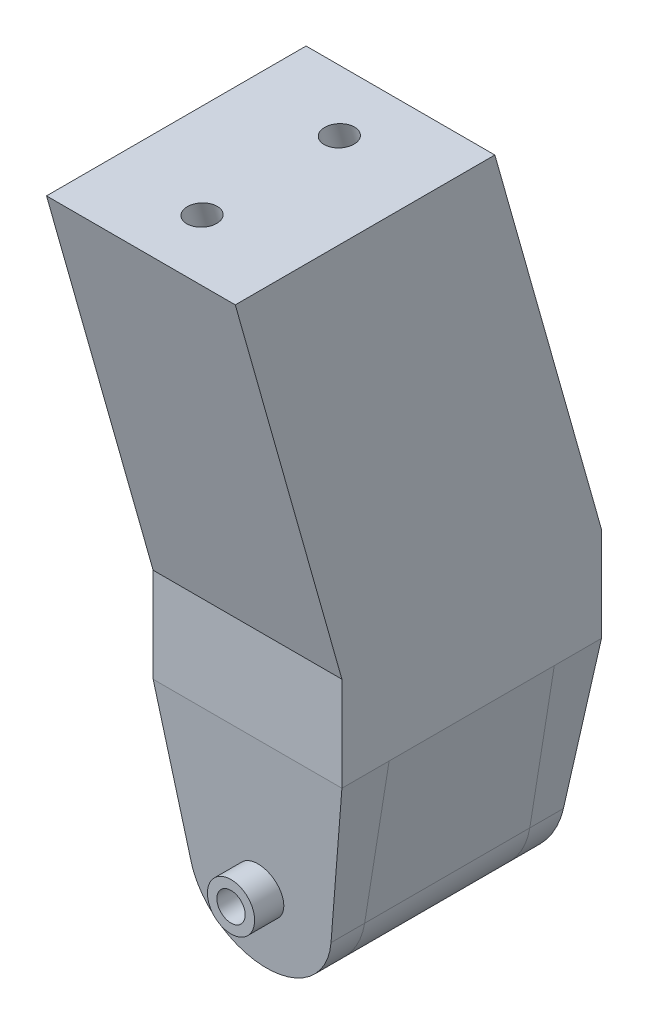
ISO-10303-21;
HEADER;
FILE_DESCRIPTION(('STEP AP214'),'2;1');
FILE_NAME('part.step','',(''),(''),'','','');
FILE_SCHEMA(('AUTOMOTIVE_DESIGN { 1 0 10303 214 1 1 1 1 }'));
ENDSEC;
DATA;
#1=APPLICATION_CONTEXT('core data for automotive mechanical design processes');
#2=APPLICATION_PROTOCOL_DEFINITION('international standard','automotive_design',2000,#1);
#3=PRODUCT_CONTEXT('',#1,'mechanical');
#4=PRODUCT('Part','Part','',(#3));
#5=PRODUCT_RELATED_PRODUCT_CATEGORY('part','',(#4));
#6=PRODUCT_DEFINITION_FORMATION('','',#4);
#7=PRODUCT_DEFINITION_CONTEXT('part definition',#1,'design');
#8=PRODUCT_DEFINITION('design','',#6,#7);
#9=PRODUCT_DEFINITION_SHAPE('','',#8);
#10=(LENGTH_UNIT() NAMED_UNIT(*) SI_UNIT(.MILLI.,.METRE.));
#11=(NAMED_UNIT(*) PLANE_ANGLE_UNIT() SI_UNIT($,.RADIAN.));
#12=(NAMED_UNIT(*) SI_UNIT($,.STERADIAN.) SOLID_ANGLE_UNIT());
#13=UNCERTAINTY_MEASURE_WITH_UNIT(LENGTH_MEASURE(1.E-05),#10,'distance_accuracy_value','');
#14=(GEOMETRIC_REPRESENTATION_CONTEXT(3) GLOBAL_UNCERTAINTY_ASSIGNED_CONTEXT((#13)) GLOBAL_UNIT_ASSIGNED_CONTEXT((#10,
#11,#12)) REPRESENTATION_CONTEXT('',''));
#15=CARTESIAN_POINT('',(0.,0.,0.));
#16=DIRECTION('',(0.,0.,1.));
#17=DIRECTION('',(1.,0.,0.));
#18=AXIS2_PLACEMENT_3D('',#15,#16,#17);
#19=CARTESIAN_POINT('',(0.,-30.,17.5));
#20=DIRECTION('',(0.,0.,1.));
#21=DIRECTION('',(1.,0.,0.));
#22=AXIS2_PLACEMENT_3D('',#19,#20,#21);
#23=PLANE('',#22);
#24=CARTESIAN_POINT('',(0.,-30.,17.5));
#25=DIRECTION('',(0.,0.,1.));
#26=DIRECTION('',(1.,0.,0.));
#27=AXIS2_PLACEMENT_3D('',#24,#25,#26);
#28=CIRCLE('',#27,15.);
#29=CARTESIAN_POINT('',(-14.8109512920612,-32.3739675280408,17.5));
#30=VERTEX_POINT('',#29);
#31=CARTESIAN_POINT('',(14.8109512920612,-32.3739675280408,17.5));
#32=VERTEX_POINT('',#31);
#33=EDGE_CURVE('E100',#30,#32,#28,.T.);
#34=ORIENTED_EDGE('',*,*,#33,.F.);
#35=DIRECTION('',(0.158264501869385,-0.987396752804077,0.));
#36=VECTOR('',#35,1.);
#37=CARTESIAN_POINT('',(-20.,0.,17.5));
#38=LINE('',#37,#36);
#39=CARTESIAN_POINT('',(-20.,0.,17.5));
#40=VERTEX_POINT('',#39);
#41=EDGE_CURVE('E13',#40,#30,#38,.T.);
#42=ORIENTED_EDGE('',*,*,#41,.F.);
#43=DIRECTION('',(-1.,0.,0.));
#44=VECTOR('',#43,1.);
#45=CARTESIAN_POINT('',(20.,0.,17.5));
#46=LINE('',#45,#44);
#47=CARTESIAN_POINT('',(20.,0.,17.5));
#48=VERTEX_POINT('',#47);
#49=EDGE_CURVE('E106',#48,#40,#46,.T.);
#50=ORIENTED_EDGE('',*,*,#49,.F.);
#51=DIRECTION('',(0.158264501869385,0.987396752804077,0.));
#52=VECTOR('',#51,1.);
#53=CARTESIAN_POINT('',(14.8109512920612,-32.3739675280408,17.5));
#54=LINE('',#53,#52);
#55=EDGE_CURVE('E95',#32,#48,#54,.T.);
#56=ORIENTED_EDGE('',*,*,#55,.F.);
#57=EDGE_LOOP('',(#34,#42,#50,#56));
#58=FACE_BOUND('',#57,.T.);
#59=CARTESIAN_POINT('',(0.,-30.,17.5));
#60=DIRECTION('',(0.,0.,1.));
#61=DIRECTION('',(1.,0.,0.));
#62=AXIS2_PLACEMENT_3D('',#59,#60,#61);
#63=CIRCLE('',#62,3.);
#64=CARTESIAN_POINT('',(3.,-30.,17.5));
#65=VERTEX_POINT('',#64);
#66=EDGE_CURVE('E112',#65,#65,#63,.T.);
#67=ORIENTED_EDGE('',*,*,#66,.T.);
#68=EDGE_LOOP('',(#67));
#69=FACE_BOUND('',#68,.T.);
#70=ADVANCED_FACE('F53',(#58,#69),#23,.F.);
#71=CARTESIAN_POINT('',(0.,-30.,87.7079728939615));
#72=DIRECTION('',(0.,0.,-1.));
#73=DIRECTION('',(-1.,0.,0.));
#74=AXIS2_PLACEMENT_3D('',#71,#72,#73);
#75=CYLINDRICAL_SURFACE('',#74,15.);
#76=CARTESIAN_POINT('',(0.,-30.,24.8333333333333));
#77=DIRECTION('',(0.,0.0885397902837944,-0.996072640692687));
#78=DIRECTION('',(0.,-0.996072640692687,-0.0885397902837944));
#79=AXIS2_PLACEMENT_3D('',#76,#77,#78);
#80=ELLIPSE('',#79,15.059142664102,15.);
#81=CARTESIAN_POINT('',(14.8109512920612,-32.3739675280408,24.6223139975075));
#82=VERTEX_POINT('',#81);
#83=CARTESIAN_POINT('',(-14.8109512920612,-32.3739675280408,24.6223139975075));
#84=VERTEX_POINT('',#83);
#85=EDGE_CURVE('E123',#82,#84,#80,.T.);
#86=ORIENTED_EDGE('',*,*,#85,.T.);
#87=DIRECTION('',(0.,0.,-1.));
#88=VECTOR('',#87,1.);
#89=CARTESIAN_POINT('',(-14.8109512920612,-32.3739675280408,87.7079728939615));
#90=LINE('',#89,#88);
#91=EDGE_CURVE('E110',#84,#30,#90,.T.);
#92=ORIENTED_EDGE('',*,*,#91,.T.);
#93=ORIENTED_EDGE('',*,*,#33,.T.);
#94=DIRECTION('',(0.,0.,-1.));
#95=VECTOR('',#94,1.);
#96=CARTESIAN_POINT('',(14.8109512920612,-32.3739675280408,87.7079728939615));
#97=LINE('',#96,#95);
#98=EDGE_CURVE('E92',#82,#32,#97,.T.);
#99=ORIENTED_EDGE('',*,*,#98,.F.);
#100=EDGE_LOOP('',(#86,#92,#93,#99));
#101=FACE_BOUND('',#100,.T.);
#102=ADVANCED_FACE('F108',(#101),#75,.T.);
#103=CARTESIAN_POINT('',(14.8109512920612,-32.3739675280408,87.7079728939615));
#104=DIRECTION('',(-0.987396752804077,0.158264501869385,0.));
#105=DIRECTION('',(-0.158264501869385,-0.987396752804077,0.));
#106=AXIS2_PLACEMENT_3D('',#103,#104,#105);
#107=PLANE('',#106);
#108=DIRECTION('',(0.,0.,-1.));
#109=VECTOR('',#108,1.);
#110=CARTESIAN_POINT('',(20.,0.,87.7079728939615));
#111=LINE('',#110,#109);
#112=CARTESIAN_POINT('',(20.,0.,27.5));
#113=VERTEX_POINT('',#112);
#114=EDGE_CURVE('E87',#113,#48,#111,.T.);
#115=ORIENTED_EDGE('',*,*,#114,.F.);
#116=DIRECTION('',(-0.157658419647184,-0.983615465079638,-0.0874324857848568));
#117=VECTOR('',#116,1.);
#118=CARTESIAN_POINT('',(15.6805535090223,-26.9486043220371,25.1045685047078));
#119=LINE('',#118,#117);
#120=EDGE_CURVE('E72',#113,#82,#119,.T.);
#121=ORIENTED_EDGE('',*,*,#120,.T.);
#122=ORIENTED_EDGE('',*,*,#98,.T.);
#123=ORIENTED_EDGE('',*,*,#55,.T.);
#124=EDGE_LOOP('',(#115,#121,#122,#123));
#125=FACE_BOUND('',#124,.T.);
#126=ADVANCED_FACE('F94',(#125),#107,.F.);
#127=CARTESIAN_POINT('',(20.,0.,87.7079728939615));
#128=DIRECTION('',(0.,-1.,0.));
#129=DIRECTION('',(0.,0.,-1.));
#130=AXIS2_PLACEMENT_3D('',#127,#128,#129);
#131=PLANE('',#130);
#132=DIRECTION('',(0.,0.,-1.));
#133=VECTOR('',#132,1.);
#134=CARTESIAN_POINT('',(-20.,0.,87.7079728939615));
#135=LINE('',#134,#133);
#136=CARTESIAN_POINT('',(-20.,0.,27.5));
#137=VERTEX_POINT('',#136);
#138=EDGE_CURVE('E63',#137,#40,#135,.T.);
#139=ORIENTED_EDGE('',*,*,#138,.F.);
#140=DIRECTION('',(1.,0.,0.));
#141=VECTOR('',#140,1.);
#142=CARTESIAN_POINT('',(20.,0.,27.5));
#143=LINE('',#142,#141);
#144=EDGE_CURVE('E57',#137,#113,#143,.T.);
#145=ORIENTED_EDGE('',*,*,#144,.T.);
#146=ORIENTED_EDGE('',*,*,#114,.T.);
#147=ORIENTED_EDGE('',*,*,#49,.T.);
#148=EDGE_LOOP('',(#139,#145,#146,#147));
#149=FACE_BOUND('',#148,.T.);
#150=ADVANCED_FACE('F159',(#149),#131,.F.);
#151=CARTESIAN_POINT('',(-20.,0.,87.7079728939615));
#152=DIRECTION('',(0.987396752804077,0.158264501869385,0.));
#153=DIRECTION('',(-0.158264501869385,0.987396752804077,0.));
#154=AXIS2_PLACEMENT_3D('',#151,#152,#153);
#155=PLANE('',#154);
#156=ORIENTED_EDGE('',*,*,#91,.F.);
#157=DIRECTION('',(-0.157658419647184,0.983615465079638,0.0874324857848568));
#158=VECTOR('',#157,1.);
#159=CARTESIAN_POINT('',(-20.8299348476848,5.17788236757763,27.9602562104513));
#160=LINE('',#159,#158);
#161=EDGE_CURVE('E125',#84,#137,#160,.T.);
#162=ORIENTED_EDGE('',*,*,#161,.T.);
#163=ORIENTED_EDGE('',*,*,#138,.T.);
#164=ORIENTED_EDGE('',*,*,#41,.T.);
#165=EDGE_LOOP('',(#156,#162,#163,#164));
#166=FACE_BOUND('',#165,.T.);
#167=ADVANCED_FACE('F156',(#166),#155,.F.);
#168=CARTESIAN_POINT('',(0.,-30.,87.7079728939615));
#169=DIRECTION('',(0.,0.,-1.));
#170=DIRECTION('',(-1.,0.,0.));
#171=AXIS2_PLACEMENT_3D('',#168,#169,#170);
#172=CYLINDRICAL_SURFACE('',#171,3.);
#173=ORIENTED_EDGE('',*,*,#66,.F.);
#174=EDGE_LOOP('',(#173));
#175=FACE_BOUND('',#174,.T.);
#176=CARTESIAN_POINT('',(0.,-30.,31.));
#177=DIRECTION('',(0.,0.,1.));
#178=DIRECTION('',(1.,0.,0.));
#179=AXIS2_PLACEMENT_3D('',#176,#177,#178);
#180=CIRCLE('',#179,3.);
#181=CARTESIAN_POINT('',(3.,-30.,31.));
#182=VERTEX_POINT('',#181);
#183=EDGE_CURVE('E133',#182,#182,#180,.T.);
#184=ORIENTED_EDGE('',*,*,#183,.T.);
#185=EDGE_LOOP('',(#184));
#186=FACE_BOUND('',#185,.T.);
#187=ADVANCED_FACE('F55',(#175,#186),#172,.F.);
#188=CARTESIAN_POINT('',(-20.,0.,27.5));
#189=DIRECTION('',(0.,0.0885397902837944,-0.996072640692687));
#190=DIRECTION('',(0.,0.996072640692687,0.0885397902837944));
#191=AXIS2_PLACEMENT_3D('',#188,#189,#190);
#192=PLANE('',#191);
#193=CARTESIAN_POINT('',(0.,-30.,24.8333333333333));
#194=DIRECTION('',(0.,0.0885397902837944,-0.996072640692687));
#195=DIRECTION('',(0.,0.996072640692687,0.0885397902837944));
#196=AXIS2_PLACEMENT_3D('',#193,#194,#195);
#197=ELLIPSE('',#196,5.01971422136734,5.);
#198=CARTESIAN_POINT('',(0.,-25.,25.2777777777778));
#199=VERTEX_POINT('',#198);
#200=EDGE_CURVE('E127',#199,#199,#197,.F.);
#201=ORIENTED_EDGE('',*,*,#200,.F.);
#202=EDGE_LOOP('',(#201));
#203=FACE_BOUND('',#202,.T.);
#204=ORIENTED_EDGE('',*,*,#144,.F.);
#205=ORIENTED_EDGE('',*,*,#161,.F.);
#206=ORIENTED_EDGE('',*,*,#85,.F.);
#207=ORIENTED_EDGE('',*,*,#120,.F.);
#208=EDGE_LOOP('',(#204,#205,#206,#207));
#209=FACE_BOUND('',#208,.T.);
#210=ADVANCED_FACE('F146',(#203,#209),#192,.F.);
#211=CARTESIAN_POINT('',(0.,-30.,10.6633175903731));
#212=DIRECTION('',(0.,0.,1.));
#213=DIRECTION('',(1.,0.,0.));
#214=AXIS2_PLACEMENT_3D('',#211,#212,#213);
#215=CYLINDRICAL_SURFACE('',#214,5.);
#216=ORIENTED_EDGE('',*,*,#200,.T.);
#217=EDGE_LOOP('',(#216));
#218=FACE_BOUND('',#217,.T.);
#219=CARTESIAN_POINT('',(0.,-30.,31.));
#220=DIRECTION('',(0.,0.,1.));
#221=DIRECTION('',(1.,0.,0.));
#222=AXIS2_PLACEMENT_3D('',#219,#220,#221);
#223=CIRCLE('',#222,5.);
#224=CARTESIAN_POINT('',(5.,-30.,31.));
#225=VERTEX_POINT('',#224);
#226=EDGE_CURVE('E130',#225,#225,#223,.T.);
#227=ORIENTED_EDGE('',*,*,#226,.F.);
#228=EDGE_LOOP('',(#227));
#229=FACE_BOUND('',#228,.T.);
#230=ADVANCED_FACE('F140',(#218,#229),#215,.T.);
#231=CARTESIAN_POINT('',(0.,-30.,31.));
#232=DIRECTION('',(0.,0.,1.));
#233=DIRECTION('',(1.,0.,0.));
#234=AXIS2_PLACEMENT_3D('',#231,#232,#233);
#235=PLANE('',#234);
#236=ORIENTED_EDGE('',*,*,#226,.T.);
#237=EDGE_LOOP('',(#236));
#238=FACE_BOUND('',#237,.T.);
#239=ORIENTED_EDGE('',*,*,#183,.F.);
#240=EDGE_LOOP('',(#239));
#241=FACE_BOUND('',#240,.T.);
#242=ADVANCED_FACE('F138',(#238,#241),#235,.T.);
#243=CLOSED_SHELL('',(#70,#102,#126,#150,#167,#187,#210,#230,#242));
#244=MANIFOLD_SOLID_BREP('B2',#243);
#245=CARTESIAN_POINT('',(0.,-30.,-17.5));
#246=DIRECTION('',(0.,0.,-1.));
#247=DIRECTION('',(-1.,0.,0.));
#248=AXIS2_PLACEMENT_3D('',#245,#246,#247);
#249=PLANE('',#248);
#250=DIRECTION('',(-0.158264501869385,0.987396752804077,0.));
#251=VECTOR('',#250,1.);
#252=CARTESIAN_POINT('',(-14.8109512920612,-32.3739675280408,-17.5));
#253=LINE('',#252,#251);
#254=CARTESIAN_POINT('',(-14.8109512920612,-32.3739675280408,-17.5));
#255=VERTEX_POINT('',#254);
#256=CARTESIAN_POINT('',(-20.,0.,-17.5));
#257=VERTEX_POINT('',#256);
#258=EDGE_CURVE('E308',#255,#257,#253,.T.);
#259=ORIENTED_EDGE('',*,*,#258,.F.);
#260=CARTESIAN_POINT('',(0.,-30.,-17.5));
#261=DIRECTION('',(0.,0.,-1.));
#262=DIRECTION('',(-1.,0.,0.));
#263=AXIS2_PLACEMENT_3D('',#260,#261,#262);
#264=CIRCLE('',#263,15.);
#265=CARTESIAN_POINT('',(14.8109512920612,-32.3739675280408,-17.5));
#266=VERTEX_POINT('',#265);
#267=EDGE_CURVE('E291',#266,#255,#264,.T.);
#268=ORIENTED_EDGE('',*,*,#267,.F.);
#269=DIRECTION('',(-0.158264501869385,-0.987396752804077,0.));
#270=VECTOR('',#269,1.);
#271=CARTESIAN_POINT('',(20.,0.,-17.5));
#272=LINE('',#271,#270);
#273=CARTESIAN_POINT('',(20.,0.,-17.5));
#274=VERTEX_POINT('',#273);
#275=EDGE_CURVE('E305',#274,#266,#272,.T.);
#276=ORIENTED_EDGE('',*,*,#275,.F.);
#277=DIRECTION('',(1.,0.,0.));
#278=VECTOR('',#277,1.);
#279=CARTESIAN_POINT('',(-20.,0.,-17.5));
#280=LINE('',#279,#278);
#281=EDGE_CURVE('E300',#257,#274,#280,.T.);
#282=ORIENTED_EDGE('',*,*,#281,.F.);
#283=EDGE_LOOP('',(#259,#268,#276,#282));
#284=FACE_BOUND('',#283,.T.);
#285=CARTESIAN_POINT('',(0.,-30.,-17.5));
#286=DIRECTION('',(0.,0.,-1.));
#287=DIRECTION('',(-1.,0.,0.));
#288=AXIS2_PLACEMENT_3D('',#285,#286,#287);
#289=CIRCLE('',#288,3.);
#290=CARTESIAN_POINT('',(-3.,-30.,-17.5));
#291=VERTEX_POINT('',#290);
#292=EDGE_CURVE('E309',#291,#291,#289,.T.);
#293=ORIENTED_EDGE('',*,*,#292,.T.);
#294=EDGE_LOOP('',(#293));
#295=FACE_BOUND('',#294,.T.);
#296=ADVANCED_FACE('F240',(#284,#295),#249,.F.);
#297=CARTESIAN_POINT('',(-14.8109512920612,-32.3739675280408,-27.5));
#298=DIRECTION('',(0.987396752804077,0.158264501869385,0.));
#299=DIRECTION('',(-0.158264501869385,0.987396752804077,0.));
#300=AXIS2_PLACEMENT_3D('',#297,#298,#299);
#301=PLANE('',#300);
#302=DIRECTION('',(0.,0.,1.));
#303=VECTOR('',#302,1.);
#304=CARTESIAN_POINT('',(-20.,0.,-27.5));
#305=LINE('',#304,#303);
#306=CARTESIAN_POINT('',(-20.,0.,-27.5));
#307=VERTEX_POINT('',#306);
#308=EDGE_CURVE('E51',#307,#257,#305,.T.);
#309=ORIENTED_EDGE('',*,*,#308,.F.);
#310=DIRECTION('',(0.157658419647184,-0.983615465079638,0.0874324857848567));
#311=VECTOR('',#310,1.);
#312=CARTESIAN_POINT('',(-14.8506186613375,-32.1264866896147,-24.6443122942565));
#313=LINE('',#312,#311);
#314=CARTESIAN_POINT('',(-14.8109512920612,-32.3739675280408,-24.6223139975075));
#315=VERTEX_POINT('',#314);
#316=EDGE_CURVE('E287',#307,#315,#313,.T.);
#317=ORIENTED_EDGE('',*,*,#316,.T.);
#318=DIRECTION('',(0.,0.,1.));
#319=VECTOR('',#318,1.);
#320=CARTESIAN_POINT('',(-14.8109512920612,-32.3739675280408,-27.5));
#321=LINE('',#320,#319);
#322=EDGE_CURVE('E255',#315,#255,#321,.T.);
#323=ORIENTED_EDGE('',*,*,#322,.T.);
#324=ORIENTED_EDGE('',*,*,#258,.T.);
#325=EDGE_LOOP('',(#309,#317,#323,#324));
#326=FACE_BOUND('',#325,.T.);
#327=ADVANCED_FACE('F242',(#326),#301,.F.);
#328=CARTESIAN_POINT('',(-20.,0.,-27.5));
#329=DIRECTION('',(0.,-1.,0.));
#330=DIRECTION('',(0.,0.,-1.));
#331=AXIS2_PLACEMENT_3D('',#328,#329,#330);
#332=PLANE('',#331);
#333=ORIENTED_EDGE('',*,*,#281,.T.);
#334=DIRECTION('',(0.,0.,1.));
#335=VECTOR('',#334,1.);
#336=CARTESIAN_POINT('',(20.,0.,-27.5));
#337=LINE('',#336,#335);
#338=CARTESIAN_POINT('',(20.,0.,-27.5));
#339=VERTEX_POINT('',#338);
#340=EDGE_CURVE('E248',#339,#274,#337,.T.);
#341=ORIENTED_EDGE('',*,*,#340,.F.);
#342=DIRECTION('',(1.,0.,0.));
#343=VECTOR('',#342,1.);
#344=CARTESIAN_POINT('',(-20.,0.,-27.5));
#345=LINE('',#344,#343);
#346=EDGE_CURVE('E283',#307,#339,#345,.T.);
#347=ORIENTED_EDGE('',*,*,#346,.F.);
#348=ORIENTED_EDGE('',*,*,#308,.T.);
#349=EDGE_LOOP('',(#333,#341,#347,#348));
#350=FACE_BOUND('',#349,.T.);
#351=ADVANCED_FACE('F299',(#350),#332,.F.);
#352=CARTESIAN_POINT('',(20.,0.,-27.5));
#353=DIRECTION('',(-0.987396752804077,0.158264501869385,0.));
#354=DIRECTION('',(-0.158264501869385,-0.987396752804077,0.));
#355=AXIS2_PLACEMENT_3D('',#352,#353,#354);
#356=PLANE('',#355);
#357=DIRECTION('',(0.,0.,1.));
#358=VECTOR('',#357,1.);
#359=CARTESIAN_POINT('',(14.8109512920612,-32.3739675280408,-27.5));
#360=LINE('',#359,#358);
#361=CARTESIAN_POINT('',(14.8109512920612,-32.3739675280408,-24.6223139975075));
#362=VERTEX_POINT('',#361);
#363=EDGE_CURVE('E262',#362,#266,#360,.T.);
#364=ORIENTED_EDGE('',*,*,#363,.F.);
#365=DIRECTION('',(0.157658419647184,0.983615465079638,-0.0874324857848567));
#366=VECTOR('',#365,1.);
#367=CARTESIAN_POINT('',(20.,0.,-27.5));
#368=LINE('',#367,#366);
#369=EDGE_CURVE('E286',#362,#339,#368,.T.);
#370=ORIENTED_EDGE('',*,*,#369,.T.);
#371=ORIENTED_EDGE('',*,*,#340,.T.);
#372=ORIENTED_EDGE('',*,*,#275,.T.);
#373=EDGE_LOOP('',(#364,#370,#371,#372));
#374=FACE_BOUND('',#373,.T.);
#375=ADVANCED_FACE('F295',(#374),#356,.F.);
#376=CARTESIAN_POINT('',(0.,-30.,-27.5));
#377=DIRECTION('',(0.,0.,1.));
#378=DIRECTION('',(1.,0.,0.));
#379=AXIS2_PLACEMENT_3D('',#376,#377,#378);
#380=CYLINDRICAL_SURFACE('',#379,15.);
#381=CARTESIAN_POINT('',(0.,-30.,-24.8333333333333));
#382=DIRECTION('',(0.,0.0885397902837943,0.996072640692686));
#383=DIRECTION('',(0.,-0.996072640692687,0.0885397902837944));
#384=AXIS2_PLACEMENT_3D('',#381,#382,#383);
#385=ELLIPSE('',#384,15.059142664102,15.);
#386=EDGE_CURVE('E297',#315,#362,#385,.T.);
#387=ORIENTED_EDGE('',*,*,#386,.T.);
#388=ORIENTED_EDGE('',*,*,#363,.T.);
#389=ORIENTED_EDGE('',*,*,#267,.T.);
#390=ORIENTED_EDGE('',*,*,#322,.F.);
#391=EDGE_LOOP('',(#387,#388,#389,#390));
#392=FACE_BOUND('',#391,.T.);
#393=ADVANCED_FACE('F348',(#392),#380,.T.);
#394=CARTESIAN_POINT('',(0.,-30.,-27.5));
#395=DIRECTION('',(0.,0.,1.));
#396=DIRECTION('',(1.,0.,0.));
#397=AXIS2_PLACEMENT_3D('',#394,#395,#396);
#398=CYLINDRICAL_SURFACE('',#397,3.);
#399=ORIENTED_EDGE('',*,*,#292,.F.);
#400=EDGE_LOOP('',(#399));
#401=FACE_BOUND('',#400,.T.);
#402=CARTESIAN_POINT('',(0.,-30.,-31.));
#403=DIRECTION('',(0.,0.,-1.));
#404=DIRECTION('',(-1.,0.,0.));
#405=AXIS2_PLACEMENT_3D('',#402,#403,#404);
#406=CIRCLE('',#405,3.);
#407=CARTESIAN_POINT('',(-3.,-30.,-31.));
#408=VERTEX_POINT('',#407);
#409=EDGE_CURVE('E321',#408,#408,#406,.T.);
#410=ORIENTED_EDGE('',*,*,#409,.T.);
#411=EDGE_LOOP('',(#410));
#412=FACE_BOUND('',#411,.T.);
#413=ADVANCED_FACE('F325',(#401,#412),#398,.F.);
#414=CARTESIAN_POINT('',(-20.,0.,-27.5));
#415=DIRECTION('',(0.,0.0885397902837943,0.996072640692686));
#416=DIRECTION('',(0.,-0.996072640692687,0.0885397902837944));
#417=AXIS2_PLACEMENT_3D('',#414,#415,#416);
#418=PLANE('',#417);
#419=CARTESIAN_POINT('',(0.,-30.,-24.8333333333333));
#420=DIRECTION('',(0.,0.0885397902837943,0.996072640692686));
#421=DIRECTION('',(0.,0.996072640692687,-0.0885397902837944));
#422=AXIS2_PLACEMENT_3D('',#419,#420,#421);
#423=ELLIPSE('',#422,5.01971422136734,5.);
#424=CARTESIAN_POINT('',(0.,-25.,-25.2777777777778));
#425=VERTEX_POINT('',#424);
#426=EDGE_CURVE('E315',#425,#425,#423,.F.);
#427=ORIENTED_EDGE('',*,*,#426,.F.);
#428=EDGE_LOOP('',(#427));
#429=FACE_BOUND('',#428,.T.);
#430=ORIENTED_EDGE('',*,*,#346,.T.);
#431=ORIENTED_EDGE('',*,*,#369,.F.);
#432=ORIENTED_EDGE('',*,*,#386,.F.);
#433=ORIENTED_EDGE('',*,*,#316,.F.);
#434=EDGE_LOOP('',(#430,#431,#432,#433));
#435=FACE_BOUND('',#434,.T.);
#436=ADVANCED_FACE('F285',(#429,#435),#418,.F.);
#437=CARTESIAN_POINT('',(0.,-30.,-10.6633175903731));
#438=DIRECTION('',(0.,0.,-1.));
#439=DIRECTION('',(-1.,0.,0.));
#440=AXIS2_PLACEMENT_3D('',#437,#438,#439);
#441=CYLINDRICAL_SURFACE('',#440,5.);
#442=ORIENTED_EDGE('',*,*,#426,.T.);
#443=EDGE_LOOP('',(#442));
#444=FACE_BOUND('',#443,.T.);
#445=CARTESIAN_POINT('',(0.,-30.,-31.));
#446=DIRECTION('',(0.,0.,-1.));
#447=DIRECTION('',(-1.,0.,0.));
#448=AXIS2_PLACEMENT_3D('',#445,#446,#447);
#449=CIRCLE('',#448,5.);
#450=CARTESIAN_POINT('',(-5.,-30.,-31.));
#451=VERTEX_POINT('',#450);
#452=EDGE_CURVE('E318',#451,#451,#449,.T.);
#453=ORIENTED_EDGE('',*,*,#452,.F.);
#454=EDGE_LOOP('',(#453));
#455=FACE_BOUND('',#454,.T.);
#456=ADVANCED_FACE('F329',(#444,#455),#441,.T.);
#457=CARTESIAN_POINT('',(0.,-30.,-31.));
#458=DIRECTION('',(0.,0.,-1.));
#459=DIRECTION('',(-1.,0.,0.));
#460=AXIS2_PLACEMENT_3D('',#457,#458,#459);
#461=PLANE('',#460);
#462=ORIENTED_EDGE('',*,*,#452,.T.);
#463=EDGE_LOOP('',(#462));
#464=FACE_BOUND('',#463,.T.);
#465=ORIENTED_EDGE('',*,*,#409,.F.);
#466=EDGE_LOOP('',(#465));
#467=FACE_BOUND('',#466,.T.);
#468=ADVANCED_FACE('F327',(#464,#467),#461,.T.);
#469=CLOSED_SHELL('',(#296,#327,#351,#375,#393,#413,#436,#456,#468));
#470=MANIFOLD_SOLID_BREP('B7',#469);
#471=CARTESIAN_POINT('',(20.,0.,87.7079728939615));
#472=DIRECTION('',(-0.987396752804077,0.158264501869385,0.));
#473=DIRECTION('',(-0.158264501869385,-0.987396752804077,0.));
#474=AXIS2_PLACEMENT_3D('',#471,#472,#473);
#475=PLANE('',#474);
#476=DIRECTION('',(0.158264501869385,0.987396752804077,0.));
#477=VECTOR('',#476,1.);
#478=CARTESIAN_POINT('',(20.,0.,17.5));
#479=LINE('',#478,#477);
#480=CARTESIAN_POINT('',(14.8109512920612,-32.3739675280408,17.5));
#481=VERTEX_POINT('',#480);
#482=CARTESIAN_POINT('',(20.,0.,17.5));
#483=VERTEX_POINT('',#482);
#484=EDGE_CURVE('E552',#481,#483,#479,.T.);
#485=ORIENTED_EDGE('',*,*,#484,.F.);
#486=DIRECTION('',(0.,0.,-1.));
#487=VECTOR('',#486,1.);
#488=CARTESIAN_POINT('',(14.8109512920612,-32.3739675280408,87.7079728939615));
#489=LINE('',#488,#487);
#490=CARTESIAN_POINT('',(14.8109512920612,-32.3739675280408,-17.5));
#491=VERTEX_POINT('',#490);
#492=EDGE_CURVE('E588',#481,#491,#489,.T.);
#493=ORIENTED_EDGE('',*,*,#492,.T.);
#494=DIRECTION('',(-0.158264501869385,-0.987396752804077,0.));
#495=VECTOR('',#494,1.);
#496=CARTESIAN_POINT('',(20.,0.,-17.5));
#497=LINE('',#496,#495);
#498=CARTESIAN_POINT('',(20.,0.,-17.5));
#499=VERTEX_POINT('',#498);
#500=EDGE_CURVE('E577',#499,#491,#497,.T.);
#501=ORIENTED_EDGE('',*,*,#500,.F.);
#502=DIRECTION('',(0.,0.,-1.));
#503=VECTOR('',#502,1.);
#504=CARTESIAN_POINT('',(20.,0.,27.5));
#505=LINE('',#504,#503);
#506=EDGE_CURVE('E593',#483,#499,#505,.T.);
#507=ORIENTED_EDGE('',*,*,#506,.F.);
#508=EDGE_LOOP('',(#485,#493,#501,#507));
#509=FACE_BOUND('',#508,.T.);
#510=ADVANCED_FACE('F418',(#509),#475,.F.);
#511=CARTESIAN_POINT('',(0.,-30.,87.7079728939615));
#512=DIRECTION('',(0.,0.,-1.));
#513=DIRECTION('',(-1.,0.,0.));
#514=AXIS2_PLACEMENT_3D('',#511,#512,#513);
#515=CYLINDRICAL_SURFACE('',#514,15.);
#516=CARTESIAN_POINT('',(0.,-30.,17.5));
#517=DIRECTION('',(0.,0.,1.));
#518=DIRECTION('',(1.,0.,0.));
#519=AXIS2_PLACEMENT_3D('',#516,#517,#518);
#520=CIRCLE('',#519,15.);
#521=CARTESIAN_POINT('',(-14.8109512920612,-32.3739675280408,17.5));
#522=VERTEX_POINT('',#521);
#523=EDGE_CURVE('E549',#522,#481,#520,.T.);
#524=ORIENTED_EDGE('',*,*,#523,.F.);
#525=DIRECTION('',(0.,0.,-1.));
#526=VECTOR('',#525,1.);
#527=CARTESIAN_POINT('',(-14.8109512920612,-32.3739675280408,87.7079728939615));
#528=LINE('',#527,#526);
#529=CARTESIAN_POINT('',(-14.8109512920612,-32.3739675280408,-17.5));
#530=VERTEX_POINT('',#529);
#531=EDGE_CURVE('E436',#522,#530,#528,.T.);
#532=ORIENTED_EDGE('',*,*,#531,.T.);
#533=CARTESIAN_POINT('',(0.,-30.,-17.5));
#534=DIRECTION('',(0.,0.,-1.));
#535=DIRECTION('',(-1.,0.,0.));
#536=AXIS2_PLACEMENT_3D('',#533,#534,#535);
#537=CIRCLE('',#536,15.);
#538=EDGE_CURVE('E565',#491,#530,#537,.T.);
#539=ORIENTED_EDGE('',*,*,#538,.F.);
#540=ORIENTED_EDGE('',*,*,#492,.F.);
#541=EDGE_LOOP('',(#524,#532,#539,#540));
#542=FACE_BOUND('',#541,.T.);
#543=ADVANCED_FACE('F649',(#542),#515,.T.);
#544=CARTESIAN_POINT('',(-20.,0.,87.7079728939615));
#545=DIRECTION('',(0.987396752804077,0.158264501869385,0.));
#546=DIRECTION('',(-0.158264501869385,0.987396752804077,0.));
#547=AXIS2_PLACEMENT_3D('',#544,#545,#546);
#548=PLANE('',#547);
#549=DIRECTION('',(0.158264501869385,-0.987396752804077,0.));
#550=VECTOR('',#549,1.);
#551=CARTESIAN_POINT('',(-14.8109512920612,-32.3739675280408,17.5));
#552=LINE('',#551,#550);
#553=CARTESIAN_POINT('',(-20.,0.,17.5));
#554=VERTEX_POINT('',#553);
#555=EDGE_CURVE('E546',#554,#522,#552,.T.);
#556=ORIENTED_EDGE('',*,*,#555,.F.);
#557=DIRECTION('',(0.,0.,1.));
#558=VECTOR('',#557,1.);
#559=CARTESIAN_POINT('',(-20.,0.,27.5));
#560=LINE('',#559,#558);
#561=CARTESIAN_POINT('',(-20.,0.,-17.5));
#562=VERTEX_POINT('',#561);
#563=EDGE_CURVE('E606',#562,#554,#560,.T.);
#564=ORIENTED_EDGE('',*,*,#563,.F.);
#565=DIRECTION('',(-0.158264501869385,0.987396752804077,0.));
#566=VECTOR('',#565,1.);
#567=CARTESIAN_POINT('',(-14.8109512920612,-32.3739675280408,-17.5));
#568=LINE('',#567,#566);
#569=EDGE_CURVE('E568',#530,#562,#568,.T.);
#570=ORIENTED_EDGE('',*,*,#569,.F.);
#571=ORIENTED_EDGE('',*,*,#531,.F.);
#572=EDGE_LOOP('',(#556,#564,#570,#571));
#573=FACE_BOUND('',#572,.T.);
#574=ADVANCED_FACE('F655',(#573),#548,.F.);
#575=CARTESIAN_POINT('',(0.,-30.,-27.5));
#576=DIRECTION('',(0.,0.,1.));
#577=DIRECTION('',(1.,0.,0.));
#578=AXIS2_PLACEMENT_3D('',#575,#576,#577);
#579=CYLINDRICAL_SURFACE('',#578,3.);
#580=CARTESIAN_POINT('',(0.,-30.,-17.5));
#581=DIRECTION('',(0.,0.,-1.));
#582=DIRECTION('',(-1.,0.,0.));
#583=AXIS2_PLACEMENT_3D('',#580,#581,#582);
#584=CIRCLE('',#583,3.);
#585=CARTESIAN_POINT('',(-3.,-30.,-17.5));
#586=VERTEX_POINT('',#585);
#587=EDGE_CURVE('E587',#586,#586,#584,.F.);
#588=ORIENTED_EDGE('',*,*,#587,.F.);
#589=EDGE_LOOP('',(#588));
#590=FACE_BOUND('',#589,.T.);
#591=CARTESIAN_POINT('',(0.,-30.,17.5));
#592=DIRECTION('',(0.,0.,1.));
#593=DIRECTION('',(1.,0.,0.));
#594=AXIS2_PLACEMENT_3D('',#591,#592,#593);
#595=CIRCLE('',#594,3.);
#596=CARTESIAN_POINT('',(3.,-30.,17.5));
#597=VERTEX_POINT('',#596);
#598=EDGE_CURVE('E564',#597,#597,#595,.F.);
#599=ORIENTED_EDGE('',*,*,#598,.F.);
#600=EDGE_LOOP('',(#599));
#601=FACE_BOUND('',#600,.T.);
#602=ADVANCED_FACE('F659',(#590,#601),#579,.F.);
#603=CARTESIAN_POINT('',(20.,20.,27.5));
#604=DIRECTION('',(-1.,0.,0.));
#605=DIRECTION('',(0.,0.,1.));
#606=AXIS2_PLACEMENT_3D('',#603,#604,#605);
#607=PLANE('',#606);
#608=CARTESIAN_POINT('',(20.,0.,27.5));
#609=VERTEX_POINT('',#608);
#610=EDGE_CURVE('E602',#609,#483,#505,.T.);
#611=ORIENTED_EDGE('',*,*,#610,.T.);
#612=ORIENTED_EDGE('',*,*,#506,.T.);
#613=DIRECTION('',(0.,0.,-1.));
#614=VECTOR('',#613,1.);
#615=CARTESIAN_POINT('',(20.,0.,-17.5));
#616=LINE('',#615,#614);
#617=CARTESIAN_POINT('',(20.,0.,-27.5));
#618=VERTEX_POINT('',#617);
#619=EDGE_CURVE('E581',#499,#618,#616,.T.);
#620=ORIENTED_EDGE('',*,*,#619,.T.);
#621=DIRECTION('',(0.,-1.,0.));
#622=VECTOR('',#621,1.);
#623=CARTESIAN_POINT('',(20.,20.,-27.5));
#624=LINE('',#623,#622);
#625=CARTESIAN_POINT('',(20.,20.,-27.5));
#626=VERTEX_POINT('',#625);
#627=EDGE_CURVE('E238',#626,#618,#624,.T.);
#628=ORIENTED_EDGE('',*,*,#627,.F.);
#629=DIRECTION('',(0.,0.962350499253202,0.27181154608867));
#630=VECTOR('',#629,1.);
#631=CARTESIAN_POINT('',(20.,20.,-27.5));
#632=LINE('',#631,#630);
#633=CARTESIAN_POINT('',(20.,100.,-4.90436181623221));
#634=VERTEX_POINT('',#633);
#635=EDGE_CURVE('E514',#626,#634,#632,.T.);
#636=ORIENTED_EDGE('',*,*,#635,.T.);
#637=DIRECTION('',(0.,0.,-1.));
#638=VECTOR('',#637,1.);
#639=CARTESIAN_POINT('',(20.,100.,50.0956381837678));
#640=LINE('',#639,#638);
#641=CARTESIAN_POINT('',(20.,100.,50.0956381837678));
#642=VERTEX_POINT('',#641);
#643=EDGE_CURVE('E507',#642,#634,#640,.T.);
#644=ORIENTED_EDGE('',*,*,#643,.F.);
#645=DIRECTION('',(0.,0.962350499253202,0.27181154608867));
#646=VECTOR('',#645,1.);
#647=CARTESIAN_POINT('',(20.,20.,27.5));
#648=LINE('',#647,#646);
#649=CARTESIAN_POINT('',(20.,20.,27.5));
#650=VERTEX_POINT('',#649);
#651=EDGE_CURVE('E538',#650,#642,#648,.T.);
#652=ORIENTED_EDGE('',*,*,#651,.F.);
#653=DIRECTION('',(0.,-1.,0.));
#654=VECTOR('',#653,1.);
#655=CARTESIAN_POINT('',(20.,20.,27.5));
#656=LINE('',#655,#654);
#657=EDGE_CURVE('E601',#650,#609,#656,.T.);
#658=ORIENTED_EDGE('',*,*,#657,.T.);
#659=EDGE_LOOP('',(#611,#612,#620,#628,#636,#644,#652,#658));
#660=FACE_BOUND('',#659,.T.);
#661=ADVANCED_FACE('F420',(#660),#607,.F.);
#662=CARTESIAN_POINT('',(-20.,20.,-27.5));
#663=DIRECTION('',(0.,0.,1.));
#664=DIRECTION('',(1.,0.,0.));
#665=AXIS2_PLACEMENT_3D('',#662,#663,#664);
#666=PLANE('',#665);
#667=ORIENTED_EDGE('',*,*,#627,.T.);
#668=DIRECTION('',(1.,0.,0.));
#669=VECTOR('',#668,1.);
#670=CARTESIAN_POINT('',(20.,0.,-27.5));
#671=LINE('',#670,#669);
#672=CARTESIAN_POINT('',(-20.,0.,-27.5));
#673=VERTEX_POINT('',#672);
#674=EDGE_CURVE('E569',#673,#618,#671,.T.);
#675=ORIENTED_EDGE('',*,*,#674,.F.);
#676=DIRECTION('',(0.,-1.,0.));
#677=VECTOR('',#676,1.);
#678=CARTESIAN_POINT('',(-20.,20.,-27.5));
#679=LINE('',#678,#677);
#680=CARTESIAN_POINT('',(-20.,20.,-27.5));
#681=VERTEX_POINT('',#680);
#682=EDGE_CURVE('E428',#681,#673,#679,.T.);
#683=ORIENTED_EDGE('',*,*,#682,.F.);
#684=DIRECTION('',(-1.,0.,0.));
#685=VECTOR('',#684,1.);
#686=CARTESIAN_POINT('',(-20.,20.,-27.5));
#687=LINE('',#686,#685);
#688=EDGE_CURVE('E527',#626,#681,#687,.T.);
#689=ORIENTED_EDGE('',*,*,#688,.F.);
#690=EDGE_LOOP('',(#667,#675,#683,#689));
#691=FACE_BOUND('',#690,.T.);
#692=ADVANCED_FACE('F671',(#691),#666,.F.);
#693=CARTESIAN_POINT('',(-20.,20.,27.5));
#694=DIRECTION('',(1.,0.,0.));
#695=DIRECTION('',(0.,0.,-1.));
#696=AXIS2_PLACEMENT_3D('',#693,#694,#695);
#697=PLANE('',#696);
#698=EDGE_CURVE('E597',#673,#562,#560,.T.);
#699=ORIENTED_EDGE('',*,*,#698,.T.);
#700=ORIENTED_EDGE('',*,*,#563,.T.);
#701=DIRECTION('',(0.,0.,1.));
#702=VECTOR('',#701,1.);
#703=CARTESIAN_POINT('',(-20.,0.,17.5));
#704=LINE('',#703,#702);
#705=CARTESIAN_POINT('',(-20.,0.,27.5));
#706=VERTEX_POINT('',#705);
#707=EDGE_CURVE('E559',#554,#706,#704,.T.);
#708=ORIENTED_EDGE('',*,*,#707,.T.);
#709=DIRECTION('',(0.,-1.,0.));
#710=VECTOR('',#709,1.);
#711=CARTESIAN_POINT('',(-20.,20.,27.5));
#712=LINE('',#711,#710);
#713=CARTESIAN_POINT('',(-20.,20.,27.5));
#714=VERTEX_POINT('',#713);
#715=EDGE_CURVE('E444',#714,#706,#712,.T.);
#716=ORIENTED_EDGE('',*,*,#715,.F.);
#717=DIRECTION('',(0.,0.962350499253202,0.27181154608867));
#718=VECTOR('',#717,1.);
#719=CARTESIAN_POINT('',(-20.,20.,27.5));
#720=LINE('',#719,#718);
#721=CARTESIAN_POINT('',(-20.,100.,50.0956381837678));
#722=VERTEX_POINT('',#721);
#723=EDGE_CURVE('E522',#714,#722,#720,.T.);
#724=ORIENTED_EDGE('',*,*,#723,.T.);
#725=DIRECTION('',(0.,0.,1.));
#726=VECTOR('',#725,1.);
#727=CARTESIAN_POINT('',(-20.,100.,-4.90436181623221));
#728=LINE('',#727,#726);
#729=CARTESIAN_POINT('',(-20.,100.,-4.90436181623221));
#730=VERTEX_POINT('',#729);
#731=EDGE_CURVE('E504',#730,#722,#728,.T.);
#732=ORIENTED_EDGE('',*,*,#731,.F.);
#733=DIRECTION('',(0.,0.962350499253202,0.27181154608867));
#734=VECTOR('',#733,1.);
#735=CARTESIAN_POINT('',(-20.,20.,-27.5));
#736=LINE('',#735,#734);
#737=EDGE_CURVE('E520',#681,#730,#736,.T.);
#738=ORIENTED_EDGE('',*,*,#737,.F.);
#739=ORIENTED_EDGE('',*,*,#682,.T.);
#740=EDGE_LOOP('',(#699,#700,#708,#716,#724,#732,#738,#739));
#741=FACE_BOUND('',#740,.T.);
#742=ADVANCED_FACE('F518',(#741),#697,.F.);
#743=CARTESIAN_POINT('',(-20.,20.,27.5));
#744=DIRECTION('',(0.,0.,-1.));
#745=DIRECTION('',(-1.,0.,0.));
#746=AXIS2_PLACEMENT_3D('',#743,#744,#745);
#747=PLANE('',#746);
#748=ORIENTED_EDGE('',*,*,#715,.T.);
#749=DIRECTION('',(-1.,0.,0.));
#750=VECTOR('',#749,1.);
#751=CARTESIAN_POINT('',(-20.,0.,27.5));
#752=LINE('',#751,#750);
#753=EDGE_CURVE('E513',#609,#706,#752,.T.);
#754=ORIENTED_EDGE('',*,*,#753,.F.);
#755=ORIENTED_EDGE('',*,*,#657,.F.);
#756=DIRECTION('',(1.,0.,0.));
#757=VECTOR('',#756,1.);
#758=CARTESIAN_POINT('',(-20.,20.,27.5));
#759=LINE('',#758,#757);
#760=EDGE_CURVE('E596',#714,#650,#759,.T.);
#761=ORIENTED_EDGE('',*,*,#760,.F.);
#762=EDGE_LOOP('',(#748,#754,#755,#761));
#763=FACE_BOUND('',#762,.T.);
#764=ADVANCED_FACE('F665',(#763),#747,.F.);
#765=CARTESIAN_POINT('',(0.,-30.,-17.5));
#766=DIRECTION('',(0.,0.,-1.));
#767=DIRECTION('',(-1.,0.,0.));
#768=AXIS2_PLACEMENT_3D('',#765,#766,#767);
#769=PLANE('',#768);
#770=ORIENTED_EDGE('',*,*,#538,.T.);
#771=ORIENTED_EDGE('',*,*,#569,.T.);
#772=DIRECTION('',(1.,0.,0.));
#773=VECTOR('',#772,1.);
#774=CARTESIAN_POINT('',(20.,0.,-17.5));
#775=LINE('',#774,#773);
#776=EDGE_CURVE('E573',#562,#499,#775,.T.);
#777=ORIENTED_EDGE('',*,*,#776,.T.);
#778=ORIENTED_EDGE('',*,*,#500,.T.);
#779=EDGE_LOOP('',(#770,#771,#777,#778));
#780=FACE_BOUND('',#779,.T.);
#781=ORIENTED_EDGE('',*,*,#587,.T.);
#782=EDGE_LOOP('',(#781));
#783=FACE_BOUND('',#782,.T.);
#784=ADVANCED_FACE('F668',(#780,#783),#769,.T.);
#785=CARTESIAN_POINT('',(20.,0.,-17.5));
#786=DIRECTION('',(0.,1.,0.));
#787=DIRECTION('',(0.,0.,1.));
#788=AXIS2_PLACEMENT_3D('',#785,#786,#787);
#789=PLANE('',#788);
#790=ORIENTED_EDGE('',*,*,#674,.T.);
#791=ORIENTED_EDGE('',*,*,#619,.F.);
#792=ORIENTED_EDGE('',*,*,#776,.F.);
#793=ORIENTED_EDGE('',*,*,#698,.F.);
#794=EDGE_LOOP('',(#790,#791,#792,#793));
#795=FACE_BOUND('',#794,.T.);
#796=ADVANCED_FACE('F683',(#795),#789,.F.);
#797=CARTESIAN_POINT('',(0.,-30.,17.5));
#798=DIRECTION('',(0.,0.,1.));
#799=DIRECTION('',(1.,0.,0.));
#800=AXIS2_PLACEMENT_3D('',#797,#798,#799);
#801=PLANE('',#800);
#802=ORIENTED_EDGE('',*,*,#555,.T.);
#803=ORIENTED_EDGE('',*,*,#523,.T.);
#804=ORIENTED_EDGE('',*,*,#484,.T.);
#805=DIRECTION('',(-1.,0.,0.));
#806=VECTOR('',#805,1.);
#807=CARTESIAN_POINT('',(-20.,0.,17.5));
#808=LINE('',#807,#806);
#809=EDGE_CURVE('E555',#483,#554,#808,.T.);
#810=ORIENTED_EDGE('',*,*,#809,.T.);
#811=EDGE_LOOP('',(#802,#803,#804,#810));
#812=FACE_BOUND('',#811,.T.);
#813=ORIENTED_EDGE('',*,*,#598,.T.);
#814=EDGE_LOOP('',(#813));
#815=FACE_BOUND('',#814,.T.);
#816=ADVANCED_FACE('F703',(#812,#815),#801,.T.);
#817=CARTESIAN_POINT('',(-20.,0.,17.5));
#818=DIRECTION('',(0.,1.,0.));
#819=DIRECTION('',(0.,0.,1.));
#820=AXIS2_PLACEMENT_3D('',#817,#818,#819);
#821=PLANE('',#820);
#822=ORIENTED_EDGE('',*,*,#753,.T.);
#823=ORIENTED_EDGE('',*,*,#707,.F.);
#824=ORIENTED_EDGE('',*,*,#809,.F.);
#825=ORIENTED_EDGE('',*,*,#610,.F.);
#826=EDGE_LOOP('',(#822,#823,#824,#825));
#827=FACE_BOUND('',#826,.T.);
#828=ADVANCED_FACE('F701',(#827),#821,.F.);
#829=CARTESIAN_POINT('',(0.,100.,22.5956381837678));
#830=DIRECTION('',(0.,1.,0.));
#831=DIRECTION('',(0.,0.,1.));
#832=AXIS2_PLACEMENT_3D('',#829,#830,#831);
#833=PLANE('',#832);
#834=CARTESIAN_POINT('',(0.,100.,37.1433523594909));
#835=DIRECTION('',(0.,1.,0.));
#836=DIRECTION('',(0.,0.,1.));
#837=AXIS2_PLACEMENT_3D('',#834,#835,#836);
#838=ELLIPSE('',#837,3.22127956748154,3.1);
#839=CARTESIAN_POINT('',(0.,100.,40.3646319269724));
#840=VERTEX_POINT('',#839);
#841=EDGE_CURVE('E422',#840,#840,#838,.T.);
#842=ORIENTED_EDGE('',*,*,#841,.F.);
#843=EDGE_LOOP('',(#842));
#844=FACE_BOUND('',#843,.T.);
#845=CARTESIAN_POINT('',(0.,100.,8.0479240080447));
#846=DIRECTION('',(0.,1.,0.));
#847=DIRECTION('',(0.,0.,1.));
#848=AXIS2_PLACEMENT_3D('',#845,#846,#847);
#849=ELLIPSE('',#848,3.22127956748154,3.1);
#850=CARTESIAN_POINT('',(0.,100.,11.2692035755262));
#851=VERTEX_POINT('',#850);
#852=EDGE_CURVE('E532',#851,#851,#849,.T.);
#853=ORIENTED_EDGE('',*,*,#852,.F.);
#854=EDGE_LOOP('',(#853));
#855=FACE_BOUND('',#854,.T.);
#856=ORIENTED_EDGE('',*,*,#731,.T.);
#857=DIRECTION('',(1.,0.,0.));
#858=VECTOR('',#857,1.);
#859=CARTESIAN_POINT('',(-20.,100.,50.0956381837678));
#860=LINE('',#859,#858);
#861=EDGE_CURVE('E535',#722,#642,#860,.T.);
#862=ORIENTED_EDGE('',*,*,#861,.T.);
#863=ORIENTED_EDGE('',*,*,#643,.T.);
#864=DIRECTION('',(-1.,0.,0.));
#865=VECTOR('',#864,1.);
#866=CARTESIAN_POINT('',(-20.,100.,-4.90436181623221));
#867=LINE('',#866,#865);
#868=EDGE_CURVE('E501',#634,#730,#867,.T.);
#869=ORIENTED_EDGE('',*,*,#868,.T.);
#870=EDGE_LOOP('',(#856,#862,#863,#869));
#871=FACE_BOUND('',#870,.T.);
#872=ADVANCED_FACE('F503',(#844,#855,#871),#833,.T.);
#873=CARTESIAN_POINT('',(-20.,20.,27.5));
#874=DIRECTION('',(0.,-0.27181154608867,0.962350499253202));
#875=DIRECTION('',(0.,-0.962350499253202,-0.271811546088671));
#876=AXIS2_PLACEMENT_3D('',#873,#874,#875);
#877=PLANE('',#876);
#878=ORIENTED_EDGE('',*,*,#651,.T.);
#879=ORIENTED_EDGE('',*,*,#861,.F.);
#880=ORIENTED_EDGE('',*,*,#723,.F.);
#881=ORIENTED_EDGE('',*,*,#760,.T.);
#882=EDGE_LOOP('',(#878,#879,#880,#881));
#883=FACE_BOUND('',#882,.T.);
#884=ADVANCED_FACE('F700',(#883),#877,.T.);
#885=CARTESIAN_POINT('',(-20.,20.,-27.5));
#886=DIRECTION('',(0.,0.27181154608867,-0.962350499253202));
#887=DIRECTION('',(0.,0.962350499253202,0.271811546088671));
#888=AXIS2_PLACEMENT_3D('',#885,#886,#887);
#889=PLANE('',#888);
#890=ORIENTED_EDGE('',*,*,#868,.F.);
#891=ORIENTED_EDGE('',*,*,#635,.F.);
#892=ORIENTED_EDGE('',*,*,#688,.T.);
#893=ORIENTED_EDGE('',*,*,#737,.T.);
#894=EDGE_LOOP('',(#890,#891,#892,#893));
#895=FACE_BOUND('',#894,.T.);
#896=ADVANCED_FACE('F526',(#895),#889,.T.);
#897=CARTESIAN_POINT('',(0.,-8.22657133206983,-22.5201815880701));
#898=DIRECTION('',(0.,0.962350499253202,0.27181154608867));
#899=DIRECTION('',(0.,-0.27181154608867,0.962350499253202));
#900=AXIS2_PLACEMENT_3D('',#897,#898,#899);
#901=CYLINDRICAL_SURFACE('',#900,3.1);
#902=ORIENTED_EDGE('',*,*,#852,.T.);
#903=EDGE_LOOP('',(#902));
#904=FACE_BOUND('',#903,.T.);
#905=CARTESIAN_POINT('',(0.,10.,-17.3721689486941));
#906=DIRECTION('',(0.,1.,0.));
#907=DIRECTION('',(0.,0.,1.));
#908=AXIS2_PLACEMENT_3D('',#905,#906,#907);
#909=ELLIPSE('',#908,3.22127956748154,3.1);
#910=CARTESIAN_POINT('',(0.,10.,-14.1508893812125));
#911=VERTEX_POINT('',#910);
#912=EDGE_CURVE('E623',#911,#911,#909,.F.);
#913=ORIENTED_EDGE('',*,*,#912,.T.);
#914=EDGE_LOOP('',(#913));
#915=FACE_BOUND('',#914,.T.);
#916=ADVANCED_FACE('F725',(#904,#915),#901,.F.);
#917=CARTESIAN_POINT('',(0.,10.,0.));
#918=DIRECTION('',(0.,1.,0.));
#919=DIRECTION('',(0.,0.,1.));
#920=AXIS2_PLACEMENT_3D('',#917,#918,#919);
#921=PLANE('',#920);
#922=ORIENTED_EDGE('',*,*,#912,.F.);
#923=EDGE_LOOP('',(#922));
#924=FACE_BOUND('',#923,.T.);
#925=ADVANCED_FACE('F645',(#924),#921,.T.);
#926=CARTESIAN_POINT('',(0.,-15.8372946225526,4.42563239101953));
#927=DIRECTION('',(0.,0.962350499253202,0.27181154608867));
#928=DIRECTION('',(0.,-0.27181154608867,0.962350499253202));
#929=AXIS2_PLACEMENT_3D('',#926,#927,#928);
#930=CYLINDRICAL_SURFACE('',#929,3.1);
#931=ORIENTED_EDGE('',*,*,#841,.T.);
#932=EDGE_LOOP('',(#931));
#933=FACE_BOUND('',#932,.T.);
#934=CARTESIAN_POINT('',(0.,10.,11.7232594027521));
#935=DIRECTION('',(0.,1.,0.));
#936=DIRECTION('',(0.,0.,1.));
#937=AXIS2_PLACEMENT_3D('',#934,#935,#936);
#938=ELLIPSE('',#937,3.22127956748154,3.1);
#939=CARTESIAN_POINT('',(0.,10.,14.9445389702337));
#940=VERTEX_POINT('',#939);
#941=EDGE_CURVE('E628',#940,#940,#938,.F.);
#942=ORIENTED_EDGE('',*,*,#941,.T.);
#943=EDGE_LOOP('',(#942));
#944=FACE_BOUND('',#943,.T.);
#945=ADVANCED_FACE('F637',(#933,#944),#930,.F.);
#946=CARTESIAN_POINT('',(0.,10.,0.));
#947=DIRECTION('',(0.,1.,0.));
#948=DIRECTION('',(0.,0.,1.));
#949=AXIS2_PLACEMENT_3D('',#946,#947,#948);
#950=PLANE('',#949);
#951=ORIENTED_EDGE('',*,*,#941,.F.);
#952=EDGE_LOOP('',(#951));
#953=FACE_BOUND('',#952,.T.);
#954=ADVANCED_FACE('F639',(#953),#950,.T.);
#955=CLOSED_SHELL('',(#510,#543,#574,#602,#661,#692,#742,#764,#784,#796,#816,#828,#872,#884,
#896,#916,#925,#945,#954));
#956=MANIFOLD_SOLID_BREP('B45',#955);
#957=ADVANCED_BREP_SHAPE_REPRESENTATION('',(#18,#244,#470,#956),#14);
#958=SHAPE_DEFINITION_REPRESENTATION(#9,#957);
ENDSEC;
END-ISO-10303-21;
